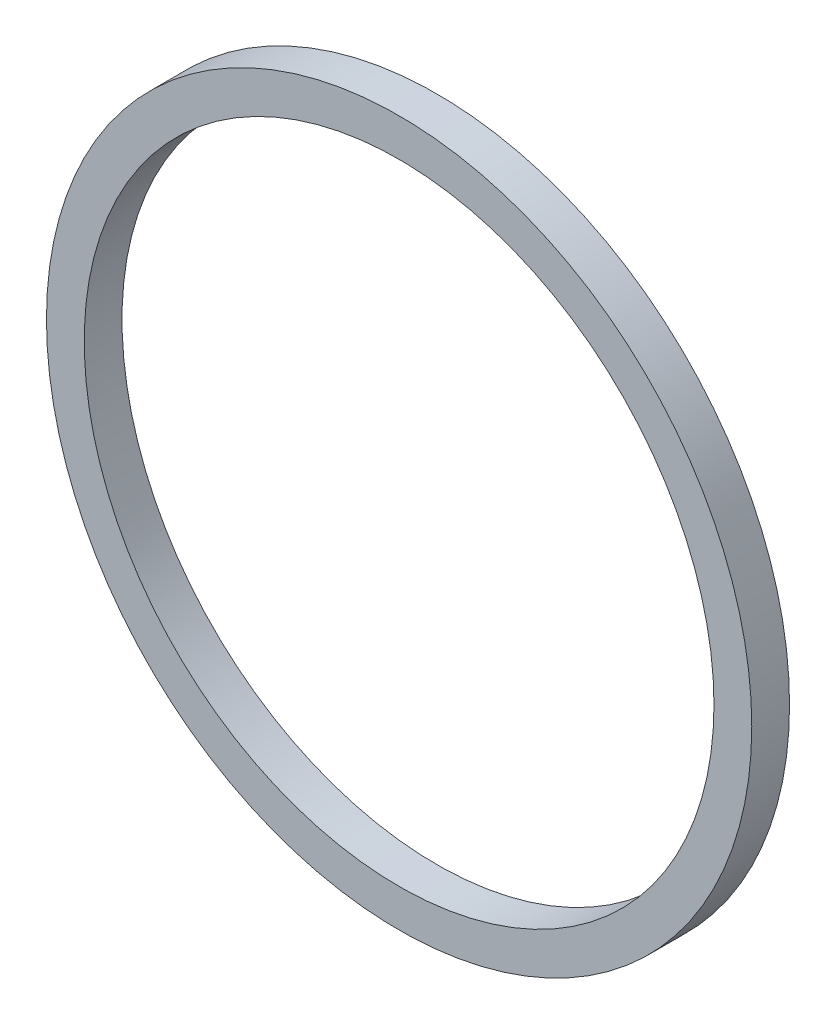
ISO-10303-21;
HEADER;
FILE_DESCRIPTION(('STEP AP214'),'2;1');
FILE_NAME('part.step','',(''),(''),'','','');
FILE_SCHEMA(('AUTOMOTIVE_DESIGN { 1 0 10303 214 1 1 1 1 }'));
ENDSEC;
DATA;
#1=APPLICATION_CONTEXT('core data for automotive mechanical design processes');
#2=APPLICATION_PROTOCOL_DEFINITION('international standard','automotive_design',2000,#1);
#3=PRODUCT_CONTEXT('',#1,'mechanical');
#4=PRODUCT('Part','Part','',(#3));
#5=PRODUCT_RELATED_PRODUCT_CATEGORY('part','',(#4));
#6=PRODUCT_DEFINITION_FORMATION('','',#4);
#7=PRODUCT_DEFINITION_CONTEXT('part definition',#1,'design');
#8=PRODUCT_DEFINITION('design','',#6,#7);
#9=PRODUCT_DEFINITION_SHAPE('','',#8);
#10=(LENGTH_UNIT() NAMED_UNIT(*) SI_UNIT(.MILLI.,.METRE.));
#11=(NAMED_UNIT(*) PLANE_ANGLE_UNIT() SI_UNIT($,.RADIAN.));
#12=(NAMED_UNIT(*) SI_UNIT($,.STERADIAN.) SOLID_ANGLE_UNIT());
#13=UNCERTAINTY_MEASURE_WITH_UNIT(LENGTH_MEASURE(1.E-05),#10,'distance_accuracy_value','');
#14=(GEOMETRIC_REPRESENTATION_CONTEXT(3) GLOBAL_UNCERTAINTY_ASSIGNED_CONTEXT((#13)) GLOBAL_UNIT_ASSIGNED_CONTEXT((#10,
#11,#12)) REPRESENTATION_CONTEXT('',''));
#15=CARTESIAN_POINT('',(0.,0.,0.));
#16=DIRECTION('',(0.,0.,1.));
#17=DIRECTION('',(1.,0.,0.));
#18=AXIS2_PLACEMENT_3D('',#15,#16,#17);
#19=CARTESIAN_POINT('',(0.,0.,1.5));
#20=DIRECTION('',(0.,0.,1.));
#21=DIRECTION('',(1.,0.,0.));
#22=AXIS2_PLACEMENT_3D('',#19,#20,#21);
#23=PLANE('',#22);
#24=CARTESIAN_POINT('',(0.,0.,1.5));
#25=DIRECTION('',(0.,0.,1.));
#26=DIRECTION('',(1.,0.,0.));
#27=AXIS2_PLACEMENT_3D('',#24,#25,#26);
#28=CIRCLE('',#27,14.);
#29=CARTESIAN_POINT('',(14.,0.,1.5));
#30=VERTEX_POINT('',#29);
#31=EDGE_CURVE('E10',#30,#30,#28,.T.);
#32=ORIENTED_EDGE('',*,*,#31,.T.);
#33=EDGE_LOOP('',(#32));
#34=FACE_BOUND('',#33,.T.);
#35=CARTESIAN_POINT('',(0.,0.,1.5));
#36=DIRECTION('',(0.,0.,1.));
#37=DIRECTION('',(1.,0.,0.));
#38=AXIS2_PLACEMENT_3D('',#35,#36,#37);
#39=CIRCLE('',#38,12.5);
#40=CARTESIAN_POINT('',(12.5,0.,1.5));
#41=VERTEX_POINT('',#40);
#42=EDGE_CURVE('E48',#41,#41,#39,.T.);
#43=ORIENTED_EDGE('',*,*,#42,.F.);
#44=EDGE_LOOP('',(#43));
#45=FACE_BOUND('',#44,.T.);
#46=ADVANCED_FACE('F37',(#34,#45),#23,.T.);
#47=CARTESIAN_POINT('',(0.,0.,0.));
#48=DIRECTION('',(0.,0.,1.));
#49=DIRECTION('',(1.,0.,0.));
#50=AXIS2_PLACEMENT_3D('',#47,#48,#49);
#51=PLANE('',#50);
#52=CARTESIAN_POINT('',(0.,0.,0.));
#53=DIRECTION('',(0.,0.,1.));
#54=DIRECTION('',(1.,0.,0.));
#55=AXIS2_PLACEMENT_3D('',#52,#53,#54);
#56=CIRCLE('',#55,14.);
#57=CARTESIAN_POINT('',(14.,0.,0.));
#58=VERTEX_POINT('',#57);
#59=EDGE_CURVE('E41',#58,#58,#56,.T.);
#60=ORIENTED_EDGE('',*,*,#59,.F.);
#61=EDGE_LOOP('',(#60));
#62=FACE_BOUND('',#61,.T.);
#63=CARTESIAN_POINT('',(0.,0.,0.));
#64=DIRECTION('',(0.,0.,1.));
#65=DIRECTION('',(1.,0.,0.));
#66=AXIS2_PLACEMENT_3D('',#63,#64,#65);
#67=CIRCLE('',#66,12.5);
#68=CARTESIAN_POINT('',(12.5,0.,0.));
#69=VERTEX_POINT('',#68);
#70=EDGE_CURVE('E50',#69,#69,#67,.T.);
#71=ORIENTED_EDGE('',*,*,#70,.T.);
#72=EDGE_LOOP('',(#71));
#73=FACE_BOUND('',#72,.T.);
#74=ADVANCED_FACE('F60',(#62,#73),#51,.F.);
#75=CARTESIAN_POINT('',(0.,0.,1.5));
#76=DIRECTION('',(0.,0.,-1.));
#77=DIRECTION('',(-1.,0.,0.));
#78=AXIS2_PLACEMENT_3D('',#75,#76,#77);
#79=CYLINDRICAL_SURFACE('',#78,14.);
#80=ORIENTED_EDGE('',*,*,#31,.F.);
#81=EDGE_LOOP('',(#80));
#82=FACE_BOUND('',#81,.T.);
#83=ORIENTED_EDGE('',*,*,#59,.T.);
#84=EDGE_LOOP('',(#83));
#85=FACE_BOUND('',#84,.T.);
#86=ADVANCED_FACE('F39',(#82,#85),#79,.T.);
#87=CARTESIAN_POINT('',(0.,0.,1.5));
#88=DIRECTION('',(0.,0.,-1.));
#89=DIRECTION('',(-1.,0.,0.));
#90=AXIS2_PLACEMENT_3D('',#87,#88,#89);
#91=CYLINDRICAL_SURFACE('',#90,12.5);
#92=ORIENTED_EDGE('',*,*,#42,.T.);
#93=EDGE_LOOP('',(#92));
#94=FACE_BOUND('',#93,.T.);
#95=ORIENTED_EDGE('',*,*,#70,.F.);
#96=EDGE_LOOP('',(#95));
#97=FACE_BOUND('',#96,.T.);
#98=ADVANCED_FACE('F56',(#94,#97),#91,.F.);
#99=CLOSED_SHELL('',(#46,#74,#86,#98));
#100=MANIFOLD_SOLID_BREP('B2',#99);
#101=ADVANCED_BREP_SHAPE_REPRESENTATION('',(#18,#100),#14);
#102=SHAPE_DEFINITION_REPRESENTATION(#9,#101);
ENDSEC;
END-ISO-10303-21;
